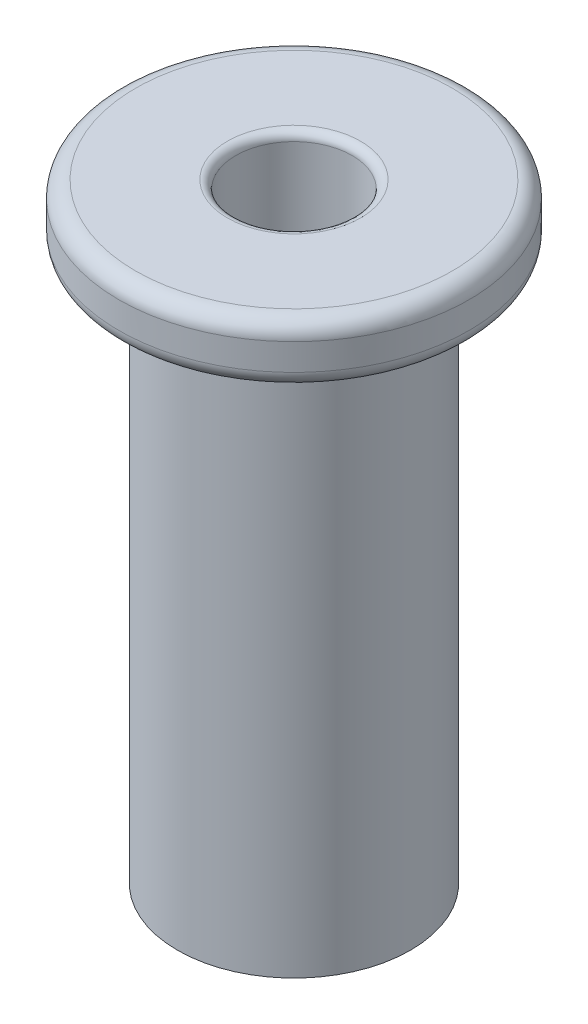
ISO-10303-21;
HEADER;
FILE_DESCRIPTION(('STEP AP214'),'2;1');
FILE_NAME('part.step','',(''),(''),'','','');
FILE_SCHEMA(('AUTOMOTIVE_DESIGN { 1 0 10303 214 1 1 1 1 }'));
ENDSEC;
DATA;
#1=APPLICATION_CONTEXT('core data for automotive mechanical design processes');
#2=APPLICATION_PROTOCOL_DEFINITION('international standard','automotive_design',2000,#1);
#3=PRODUCT_CONTEXT('',#1,'mechanical');
#4=PRODUCT('Part','Part','',(#3));
#5=PRODUCT_RELATED_PRODUCT_CATEGORY('part','',(#4));
#6=PRODUCT_DEFINITION_FORMATION('','',#4);
#7=PRODUCT_DEFINITION_CONTEXT('part definition',#1,'design');
#8=PRODUCT_DEFINITION('design','',#6,#7);
#9=PRODUCT_DEFINITION_SHAPE('','',#8);
#10=(LENGTH_UNIT() NAMED_UNIT(*) SI_UNIT(.MILLI.,.METRE.));
#11=(NAMED_UNIT(*) PLANE_ANGLE_UNIT() SI_UNIT($,.RADIAN.));
#12=(NAMED_UNIT(*) SI_UNIT($,.STERADIAN.) SOLID_ANGLE_UNIT());
#13=UNCERTAINTY_MEASURE_WITH_UNIT(LENGTH_MEASURE(1.E-05),#10,'distance_accuracy_value','');
#14=(GEOMETRIC_REPRESENTATION_CONTEXT(3) GLOBAL_UNCERTAINTY_ASSIGNED_CONTEXT((#13)) GLOBAL_UNIT_ASSIGNED_CONTEXT((#10,
#11,#12)) REPRESENTATION_CONTEXT('',''));
#15=CARTESIAN_POINT('',(0.,0.,0.));
#16=DIRECTION('',(0.,0.,1.));
#17=DIRECTION('',(1.,0.,0.));
#18=AXIS2_PLACEMENT_3D('',#15,#16,#17);
#19=CARTESIAN_POINT('',(0.,18.3,0.));
#20=DIRECTION('',(0.,-1.,0.));
#21=DIRECTION('',(0.,0.,-1.));
#22=AXIS2_PLACEMENT_3D('',#19,#20,#21);
#23=CYLINDRICAL_SURFACE('',#22,5.2575);
#24=CARTESIAN_POINT('',(0.,17.,0.));
#25=DIRECTION('',(0.,-1.,0.));
#26=DIRECTION('',(0.,0.,-1.));
#27=AXIS2_PLACEMENT_3D('',#24,#25,#26);
#28=CIRCLE('',#27,5.2575);
#29=CARTESIAN_POINT('',(0.,17.,-5.2575));
#30=VERTEX_POINT('',#29);
#31=EDGE_CURVE('E10',#30,#30,#28,.F.);
#32=ORIENTED_EDGE('',*,*,#31,.T.);
#33=EDGE_LOOP('',(#32));
#34=FACE_BOUND('',#33,.T.);
#35=CARTESIAN_POINT('',(0.,17.8,0.));
#36=DIRECTION('',(0.,1.,0.));
#37=DIRECTION('',(0.,0.,1.));
#38=AXIS2_PLACEMENT_3D('',#35,#36,#37);
#39=CIRCLE('',#38,5.2575);
#40=CARTESIAN_POINT('',(0.,17.8,5.2575));
#41=VERTEX_POINT('',#40);
#42=EDGE_CURVE('E59',#41,#41,#39,.F.);
#43=ORIENTED_EDGE('',*,*,#42,.T.);
#44=EDGE_LOOP('',(#43));
#45=FACE_BOUND('',#44,.T.);
#46=ADVANCED_FACE('F39',(#34,#45),#23,.T.);
#47=CARTESIAN_POINT('',(0.,0.,0.));
#48=DIRECTION('',(0.,1.,0.));
#49=DIRECTION('',(0.,0.,1.));
#50=AXIS2_PLACEMENT_3D('',#47,#48,#49);
#51=PLANE('',#50);
#52=CARTESIAN_POINT('',(0.,0.,0.));
#53=DIRECTION('',(0.,-1.,0.));
#54=DIRECTION('',(0.,0.,-1.));
#55=AXIS2_PLACEMENT_3D('',#52,#53,#54);
#56=CIRCLE('',#55,1.75);
#57=CARTESIAN_POINT('',(0.,0.,-1.75));
#58=VERTEX_POINT('',#57);
#59=EDGE_CURVE('E65',#58,#58,#56,.T.);
#60=ORIENTED_EDGE('',*,*,#59,.F.);
#61=EDGE_LOOP('',(#60));
#62=FACE_BOUND('',#61,.T.);
#63=CARTESIAN_POINT('',(0.,0.,0.));
#64=DIRECTION('',(0.,-1.,0.));
#65=DIRECTION('',(0.,0.,-1.));
#66=AXIS2_PLACEMENT_3D('',#63,#64,#65);
#67=CIRCLE('',#66,3.5);
#68=CARTESIAN_POINT('',(0.,0.,-3.5));
#69=VERTEX_POINT('',#68);
#70=EDGE_CURVE('E69',#69,#69,#67,.T.);
#71=ORIENTED_EDGE('',*,*,#70,.T.);
#72=EDGE_LOOP('',(#71));
#73=FACE_BOUND('',#72,.T.);
#74=ADVANCED_FACE('F93',(#62,#73),#51,.F.);
#75=CARTESIAN_POINT('',(0.,18.3,0.));
#76=DIRECTION('',(0.,1.,0.));
#77=DIRECTION('',(0.,0.,1.));
#78=AXIS2_PLACEMENT_3D('',#75,#76,#77);
#79=PLANE('',#78);
#80=CARTESIAN_POINT('',(0.,18.3,0.));
#81=DIRECTION('',(0.,1.,0.));
#82=DIRECTION('',(0.,0.,1.));
#83=AXIS2_PLACEMENT_3D('',#80,#81,#82);
#84=CIRCLE('',#83,2.);
#85=CARTESIAN_POINT('',(0.,18.3,2.));
#86=VERTEX_POINT('',#85);
#87=EDGE_CURVE('E50',#86,#86,#84,.F.);
#88=ORIENTED_EDGE('',*,*,#87,.T.);
#89=EDGE_LOOP('',(#88));
#90=FACE_BOUND('',#89,.T.);
#91=CARTESIAN_POINT('',(0.,18.3,0.));
#92=DIRECTION('',(0.,1.,0.));
#93=DIRECTION('',(0.,0.,1.));
#94=AXIS2_PLACEMENT_3D('',#91,#92,#93);
#95=CIRCLE('',#94,4.7575);
#96=CARTESIAN_POINT('',(0.,18.3,4.7575));
#97=VERTEX_POINT('',#96);
#98=EDGE_CURVE('E62',#97,#97,#95,.T.);
#99=ORIENTED_EDGE('',*,*,#98,.T.);
#100=EDGE_LOOP('',(#99));
#101=FACE_BOUND('',#100,.T.);
#102=ADVANCED_FACE('F90',(#90,#101),#79,.T.);
#103=CARTESIAN_POINT('',(0.,19.8,0.));
#104=DIRECTION('',(0.,-1.,0.));
#105=DIRECTION('',(0.,0.,-1.));
#106=AXIS2_PLACEMENT_3D('',#103,#104,#105);
#107=CYLINDRICAL_SURFACE('',#106,1.75);
#108=CARTESIAN_POINT('',(0.,18.05,0.));
#109=DIRECTION('',(0.,1.,0.));
#110=DIRECTION('',(0.,0.,1.));
#111=AXIS2_PLACEMENT_3D('',#108,#109,#110);
#112=CIRCLE('',#111,1.75);
#113=CARTESIAN_POINT('',(0.,18.05,-1.75));
#114=VERTEX_POINT('',#113);
#115=EDGE_CURVE('E54',#114,#114,#112,.T.);
#116=CARTESIAN_POINT('',(0.,18.05,-1.75));
#117=CARTESIAN_POINT('',(0.,17.8619791666667,-1.75));
#118=CARTESIAN_POINT('',(0.,17.6739583333333,-1.75));
#119=CARTESIAN_POINT('',(0.,17.2979166666667,-1.75));
#120=CARTESIAN_POINT('',(0.,17.1098958333333,-1.75));
#121=CARTESIAN_POINT('',(0.,16.7338541666667,-1.75));
#122=CARTESIAN_POINT('',(0.,16.5458333333333,-1.75));
#123=CARTESIAN_POINT('',(0.,16.1697916666667,-1.75));
#124=CARTESIAN_POINT('',(0.,15.9817708333333,-1.75));
#125=CARTESIAN_POINT('',(0.,15.6057291666667,-1.75));
#126=CARTESIAN_POINT('',(0.,15.4177083333333,-1.75));
#127=CARTESIAN_POINT('',(0.,15.0416666666667,-1.75));
#128=CARTESIAN_POINT('',(0.,14.8536458333333,-1.75));
#129=CARTESIAN_POINT('',(0.,14.4776041666667,-1.75));
#130=CARTESIAN_POINT('',(0.,14.2895833333333,-1.75));
#131=CARTESIAN_POINT('',(0.,13.9135416666667,-1.75));
#132=CARTESIAN_POINT('',(0.,13.7255208333333,-1.75));
#133=CARTESIAN_POINT('',(0.,13.3494791666667,-1.75));
#134=CARTESIAN_POINT('',(0.,13.1614583333333,-1.75));
#135=CARTESIAN_POINT('',(0.,12.7854166666667,-1.75));
#136=CARTESIAN_POINT('',(0.,12.5973958333333,-1.75));
#137=CARTESIAN_POINT('',(0.,12.2213541666667,-1.75));
#138=CARTESIAN_POINT('',(0.,12.0333333333333,-1.75));
#139=CARTESIAN_POINT('',(0.,11.6572916666667,-1.75));
#140=CARTESIAN_POINT('',(0.,11.4692708333333,-1.75));
#141=CARTESIAN_POINT('',(0.,11.0932291666667,-1.75));
#142=CARTESIAN_POINT('',(0.,10.9052083333333,-1.75));
#143=CARTESIAN_POINT('',(0.,10.5291666666667,-1.75));
#144=CARTESIAN_POINT('',(0.,10.3411458333333,-1.75));
#145=CARTESIAN_POINT('',(0.,9.96510416666666,-1.75));
#146=CARTESIAN_POINT('',(0.,9.77708333333333,-1.75));
#147=CARTESIAN_POINT('',(0.,9.40104166666666,-1.75));
#148=CARTESIAN_POINT('',(0.,9.21302083333333,-1.75));
#149=CARTESIAN_POINT('',(0.,8.83697916666667,-1.75));
#150=CARTESIAN_POINT('',(0.,8.64895833333333,-1.75));
#151=CARTESIAN_POINT('',(0.,8.27291666666667,-1.75));
#152=CARTESIAN_POINT('',(0.,8.08489583333333,-1.75));
#153=CARTESIAN_POINT('',(0.,7.70885416666666,-1.75));
#154=CARTESIAN_POINT('',(0.,7.52083333333333,-1.75));
#155=CARTESIAN_POINT('',(0.,7.14479166666666,-1.75));
#156=CARTESIAN_POINT('',(0.,6.95677083333333,-1.75));
#157=CARTESIAN_POINT('',(0.,6.58072916666666,-1.75));
#158=CARTESIAN_POINT('',(0.,6.39270833333333,-1.75));
#159=CARTESIAN_POINT('',(0.,6.01666666666666,-1.75));
#160=CARTESIAN_POINT('',(0.,5.82864583333333,-1.75));
#161=CARTESIAN_POINT('',(0.,5.45260416666666,-1.75));
#162=CARTESIAN_POINT('',(0.,5.26458333333333,-1.75));
#163=CARTESIAN_POINT('',(0.,4.88854166666666,-1.75));
#164=CARTESIAN_POINT('',(0.,4.70052083333333,-1.75));
#165=CARTESIAN_POINT('',(0.,4.32447916666666,-1.75));
#166=CARTESIAN_POINT('',(0.,4.13645833333333,-1.75));
#167=CARTESIAN_POINT('',(0.,3.76041666666667,-1.75));
#168=CARTESIAN_POINT('',(0.,3.57239583333333,-1.75));
#169=CARTESIAN_POINT('',(0.,3.19635416666666,-1.75));
#170=CARTESIAN_POINT('',(0.,3.00833333333333,-1.75));
#171=CARTESIAN_POINT('',(0.,2.63229166666667,-1.75));
#172=CARTESIAN_POINT('',(0.,2.44427083333333,-1.75));
#173=CARTESIAN_POINT('',(0.,2.06822916666667,-1.75));
#174=CARTESIAN_POINT('',(0.,1.88020833333333,-1.75));
#175=CARTESIAN_POINT('',(0.,1.50416666666667,-1.75));
#176=CARTESIAN_POINT('',(0.,1.31614583333333,-1.75));
#177=CARTESIAN_POINT('',(0.,0.940104166666666,-1.75));
#178=CARTESIAN_POINT('',(0.,0.752083333333331,-1.75));
#179=CARTESIAN_POINT('',(0.,0.376041666666665,-1.75));
#180=CARTESIAN_POINT('',(0.,0.188020833333332,-1.75));
#181=CARTESIAN_POINT('',(0.,0.,-1.75));
#182=B_SPLINE_CURVE_WITH_KNOTS('',3,(#116,#117,#118,#119,#120,#121,#122,#123,#124,#125,#126,
#127,#128,#129,#130,#131,#132,#133,#134,#135,#136,#137,#138,#139,#140,#141,#142,#143,#144,#145,
#146,#147,#148,#149,#150,#151,#152,#153,#154,#155,#156,#157,#158,#159,#160,#161,#162,#163,#164,
#165,#166,#167,#168,#169,#170,#171,#172,#173,#174,#175,#176,#177,#178,#179,#180,#181),
.UNSPECIFIED.,.F.,.F.,(4,2,2,2,2,2,2,2,2,2,2,2,2,2,2,2,2,2,2,2,2,2,2,2,2,2,2,2,2,2,2,2,4),(0.,
0.5640625,1.128125,1.6921875,2.25625,2.8203125,3.384375,3.9484375,4.5125,5.0765625,5.640625,
6.2046875,6.76875,7.3328125,7.896875,8.4609375,9.025,9.5890625,10.153125,10.7171875,11.28125,
11.8453125,12.409375,12.9734375,13.5375,14.1015625,14.665625,15.2296875,15.79375,16.3578125,
16.921875,17.4859375,18.05),.UNSPECIFIED.);
#183=EDGE_CURVE('BSEAM80',#114,#58,#182,.T.);
#184=ORIENTED_EDGE('',*,*,#115,.T.);
#185=ORIENTED_EDGE('',*,*,#59,.T.);
#186=ORIENTED_EDGE('',*,*,#183,.T.);
#187=ORIENTED_EDGE('',*,*,#183,.F.);
#188=EDGE_LOOP('',(#184,#186,#185,#187));
#189=FACE_BOUND('',#188,.T.);
#190=ADVANCED_FACE('F80',(#189),#107,.F.);
#191=CARTESIAN_POINT('',(0.,16.5,0.));
#192=DIRECTION('',(0.,-1.,0.));
#193=DIRECTION('',(0.,0.,-1.));
#194=AXIS2_PLACEMENT_3D('',#191,#192,#193);
#195=PLANE('',#194);
#196=CARTESIAN_POINT('',(0.,16.5,0.));
#197=DIRECTION('',(0.,-1.,0.));
#198=DIRECTION('',(0.,0.,-1.));
#199=AXIS2_PLACEMENT_3D('',#196,#197,#198);
#200=CIRCLE('',#199,4.7575);
#201=CARTESIAN_POINT('',(0.,16.5,-4.7575));
#202=VERTEX_POINT('',#201);
#203=EDGE_CURVE('E46',#202,#202,#200,.T.);
#204=ORIENTED_EDGE('',*,*,#203,.T.);
#205=EDGE_LOOP('',(#204));
#206=FACE_BOUND('',#205,.T.);
#207=CARTESIAN_POINT('',(0.,16.5,0.));
#208=DIRECTION('',(0.,-1.,0.));
#209=DIRECTION('',(0.,0.,-1.));
#210=AXIS2_PLACEMENT_3D('',#207,#208,#209);
#211=CIRCLE('',#210,3.5);
#212=CARTESIAN_POINT('',(0.,16.5,-3.5));
#213=VERTEX_POINT('',#212);
#214=EDGE_CURVE('E68',#213,#213,#211,.T.);
#215=ORIENTED_EDGE('',*,*,#214,.F.);
#216=EDGE_LOOP('',(#215));
#217=FACE_BOUND('',#216,.T.);
#218=ADVANCED_FACE('F78',(#206,#217),#195,.T.);
#219=CARTESIAN_POINT('',(0.,16.5,0.));
#220=DIRECTION('',(0.,-1.,0.));
#221=DIRECTION('',(0.,0.,-1.));
#222=AXIS2_PLACEMENT_3D('',#219,#220,#221);
#223=CYLINDRICAL_SURFACE('',#222,3.5);
#224=ORIENTED_EDGE('',*,*,#214,.T.);
#225=EDGE_LOOP('',(#224));
#226=FACE_BOUND('',#225,.T.);
#227=ORIENTED_EDGE('',*,*,#70,.F.);
#228=EDGE_LOOP('',(#227));
#229=FACE_BOUND('',#228,.T.);
#230=ADVANCED_FACE('F75',(#226,#229),#223,.T.);
#231=CARTESIAN_POINT('',(0.,17.8,0.));
#232=DIRECTION('',(0.,1.,0.));
#233=DIRECTION('',(0.,0.,1.));
#234=AXIS2_PLACEMENT_3D('',#231,#232,#233);
#235=TOROIDAL_SURFACE('',#234,4.7575,0.5);
#236=ORIENTED_EDGE('',*,*,#42,.F.);
#237=EDGE_LOOP('',(#236));
#238=FACE_BOUND('',#237,.T.);
#239=ORIENTED_EDGE('',*,*,#98,.F.);
#240=EDGE_LOOP('',(#239));
#241=FACE_BOUND('',#240,.T.);
#242=ADVANCED_FACE('F87',(#238,#241),#235,.T.);
#243=CARTESIAN_POINT('',(0.,18.05,0.));
#244=DIRECTION('',(0.,1.,0.));
#245=DIRECTION('',(0.,0.,1.));
#246=AXIS2_PLACEMENT_3D('',#243,#244,#245);
#247=TOROIDAL_SURFACE('',#246,2.,0.25);
#248=ORIENTED_EDGE('',*,*,#87,.F.);
#249=EDGE_LOOP('',(#248));
#250=FACE_BOUND('',#249,.T.);
#251=ORIENTED_EDGE('',*,*,#115,.F.);
#252=EDGE_LOOP('',(#251));
#253=FACE_BOUND('',#252,.T.);
#254=ADVANCED_FACE('F105',(#250,#253),#247,.T.);
#255=CARTESIAN_POINT('',(0.,17.,0.));
#256=DIRECTION('',(0.,-1.,0.));
#257=DIRECTION('',(0.,0.,-1.));
#258=AXIS2_PLACEMENT_3D('',#255,#256,#257);
#259=TOROIDAL_SURFACE('',#258,4.7575,0.5);
#260=ORIENTED_EDGE('',*,*,#31,.F.);
#261=EDGE_LOOP('',(#260));
#262=FACE_BOUND('',#261,.T.);
#263=ORIENTED_EDGE('',*,*,#203,.F.);
#264=EDGE_LOOP('',(#263));
#265=FACE_BOUND('',#264,.T.);
#266=ADVANCED_FACE('F41',(#262,#265),#259,.T.);
#267=CLOSED_SHELL('',(#46,#74,#102,#190,#218,#230,#242,#254,#266));
#268=MANIFOLD_SOLID_BREP('B2',#267);
#269=ADVANCED_BREP_SHAPE_REPRESENTATION('',(#18,#268),#14);
#270=SHAPE_DEFINITION_REPRESENTATION(#9,#269);
ENDSEC;
END-ISO-10303-21;
